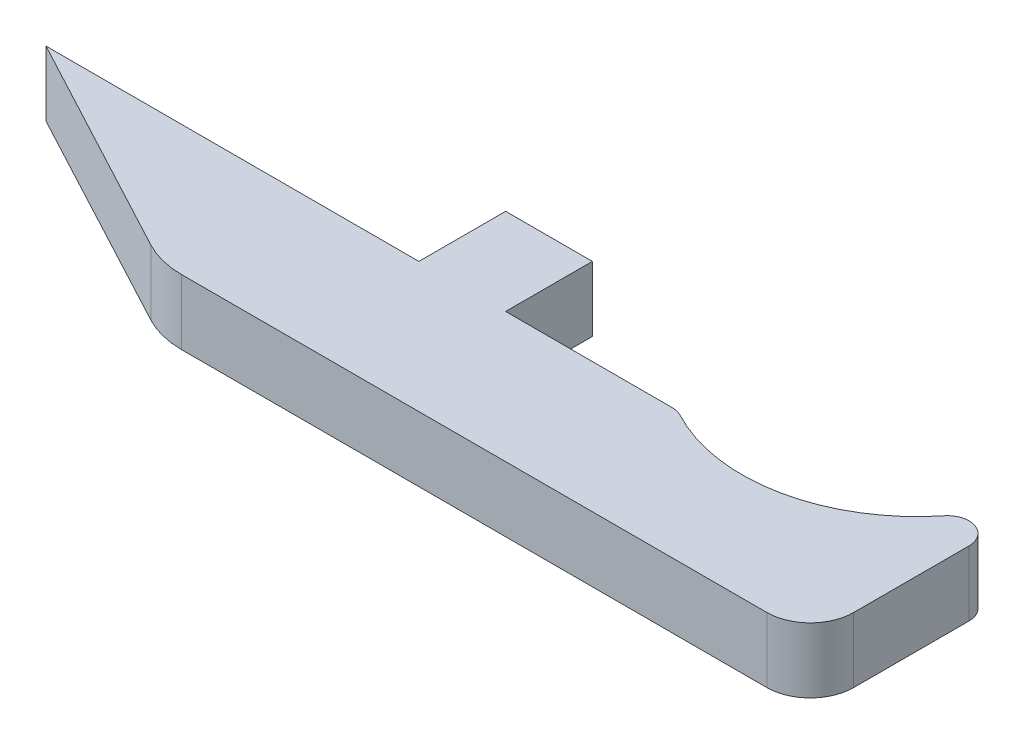
ISO-10303-21;
HEADER;
FILE_DESCRIPTION(('STEP AP214'),'2;1');
FILE_NAME('part.step','',(''),(''),'','','');
FILE_SCHEMA(('AUTOMOTIVE_DESIGN { 1 0 10303 214 1 1 1 1 }'));
ENDSEC;
DATA;
#1=APPLICATION_CONTEXT('core data for automotive mechanical design processes');
#2=APPLICATION_PROTOCOL_DEFINITION('international standard','automotive_design',2000,#1);
#3=PRODUCT_CONTEXT('',#1,'mechanical');
#4=PRODUCT('Part','Part','',(#3));
#5=PRODUCT_RELATED_PRODUCT_CATEGORY('part','',(#4));
#6=PRODUCT_DEFINITION_FORMATION('','',#4);
#7=PRODUCT_DEFINITION_CONTEXT('part definition',#1,'design');
#8=PRODUCT_DEFINITION('design','',#6,#7);
#9=PRODUCT_DEFINITION_SHAPE('','',#8);
#10=(LENGTH_UNIT() NAMED_UNIT(*) SI_UNIT(.MILLI.,.METRE.));
#11=(NAMED_UNIT(*) PLANE_ANGLE_UNIT() SI_UNIT($,.RADIAN.));
#12=(NAMED_UNIT(*) SI_UNIT($,.STERADIAN.) SOLID_ANGLE_UNIT());
#13=UNCERTAINTY_MEASURE_WITH_UNIT(LENGTH_MEASURE(1.E-05),#10,'distance_accuracy_value','');
#14=(GEOMETRIC_REPRESENTATION_CONTEXT(3) GLOBAL_UNCERTAINTY_ASSIGNED_CONTEXT((#13)) GLOBAL_UNIT_ASSIGNED_CONTEXT((#10,
#11,#12)) REPRESENTATION_CONTEXT('',''));
#15=CARTESIAN_POINT('',(0.,0.,0.));
#16=DIRECTION('',(0.,0.,1.));
#17=DIRECTION('',(1.,0.,0.));
#18=AXIS2_PLACEMENT_3D('',#15,#16,#17);
#19=CARTESIAN_POINT('',(0.,4.7625,42.5794309916899));
#20=DIRECTION('',(0.,0.,1.));
#21=DIRECTION('',(1.,0.,0.));
#22=AXIS2_PLACEMENT_3D('',#19,#20,#21);
#23=PLANE('',#22);
#24=DIRECTION('',(0.,-1.,0.));
#25=VECTOR('',#24,1.);
#26=CARTESIAN_POINT('',(39.9394999999781,4.7625,42.5794309916899));
#27=LINE('',#26,#25);
#28=CARTESIAN_POINT('',(39.9394999999781,4.7625,42.5794309916899));
#29=VERTEX_POINT('',#28);
#30=CARTESIAN_POINT('',(39.9394999999781,0.,42.5794309916899));
#31=VERTEX_POINT('',#30);
#32=EDGE_CURVE('E64',#29,#31,#27,.T.);
#33=ORIENTED_EDGE('',*,*,#32,.F.);
#34=DIRECTION('',(-1.,0.,0.));
#35=VECTOR('',#34,1.);
#36=CARTESIAN_POINT('',(0.,4.7625,42.5794309916899));
#37=LINE('',#36,#35);
#38=CARTESIAN_POINT('',(52.1487518651466,4.7625,42.5794309916899));
#39=VERTEX_POINT('',#38);
#40=EDGE_CURVE('E174',#39,#29,#37,.T.);
#41=ORIENTED_EDGE('',*,*,#40,.F.);
#42=DIRECTION('',(0.,1.,0.));
#43=VECTOR('',#42,1.);
#44=CARTESIAN_POINT('',(52.1487518651466,0.,42.5794309916899));
#45=LINE('',#44,#43);
#46=CARTESIAN_POINT('',(52.1487518651466,0.,42.5794309916899));
#47=VERTEX_POINT('',#46);
#48=EDGE_CURVE('E197',#39,#47,#45,.F.);
#49=ORIENTED_EDGE('',*,*,#48,.T.);
#50=DIRECTION('',(-1.,0.,0.));
#51=VECTOR('',#50,1.);
#52=CARTESIAN_POINT('',(0.,0.,42.5794309916899));
#53=LINE('',#52,#51);
#54=EDGE_CURVE('E186',#47,#31,#53,.T.);
#55=ORIENTED_EDGE('',*,*,#54,.T.);
#56=EDGE_LOOP('',(#33,#41,#49,#55));
#57=FACE_BOUND('',#56,.T.);
#58=ADVANCED_FACE('F41',(#57),#23,.F.);
#59=DIRECTION('',(0.,1.,0.));
#60=VECTOR('',#59,1.);
#61=CARTESIAN_POINT('',(33.5894999999781,4.7625,42.5794309916899));
#62=LINE('',#61,#60);
#63=CARTESIAN_POINT('',(33.5894999999781,0.,42.5794309916899));
#64=VERTEX_POINT('',#63);
#65=CARTESIAN_POINT('',(33.5894999999781,4.7625,42.5794309916899));
#66=VERTEX_POINT('',#65);
#67=EDGE_CURVE('E158',#64,#66,#62,.T.);
#68=ORIENTED_EDGE('',*,*,#67,.F.);
#69=CARTESIAN_POINT('',(6.28449999997809,0.,42.5794309916899));
#70=VERTEX_POINT('',#69);
#71=EDGE_CURVE('E164',#64,#70,#53,.T.);
#72=ORIENTED_EDGE('',*,*,#71,.T.);
#73=DIRECTION('',(0.,-1.,0.));
#74=VECTOR('',#73,1.);
#75=CARTESIAN_POINT('',(6.28449999997809,4.7625,42.5794309916899));
#76=LINE('',#75,#74);
#77=CARTESIAN_POINT('',(6.28449999997809,4.7625,42.5794309916899));
#78=VERTEX_POINT('',#77);
#79=EDGE_CURVE('E184',#78,#70,#76,.T.);
#80=ORIENTED_EDGE('',*,*,#79,.F.);
#81=EDGE_CURVE('E56',#66,#78,#37,.T.);
#82=ORIENTED_EDGE('',*,*,#81,.F.);
#83=EDGE_LOOP('',(#68,#72,#80,#82));
#84=FACE_BOUND('',#83,.T.);
#85=ADVANCED_FACE('F269',(#84),#23,.F.);
#86=CARTESIAN_POINT('',(58.9432399959774,4.7625,31.4542309916899));
#87=DIRECTION('',(0.,-1.,0.));
#88=DIRECTION('',(0.,0.,-1.));
#89=AXIS2_PLACEMENT_3D('',#86,#87,#88);
#90=CYLINDRICAL_SURFACE('',#89,12.827);
#91=CARTESIAN_POINT('',(58.9432399959774,0.,31.4542309916899));
#92=DIRECTION('',(0.,1.,0.));
#93=DIRECTION('',(0.,0.,1.));
#94=AXIS2_PLACEMENT_3D('',#91,#92,#93);
#95=CIRCLE('',#94,12.827);
#96=CARTESIAN_POINT('',(52.8970435095112,0.,42.7668538991789));
#97=VERTEX_POINT('',#96);
#98=CARTESIAN_POINT('',(68.9449095995016,0.,39.4853289329393));
#99=VERTEX_POINT('',#98);
#100=EDGE_CURVE('E161',#97,#99,#95,.T.);
#101=ORIENTED_EDGE('',*,*,#100,.F.);
#102=DIRECTION('',(0.,-1.,0.));
#103=VECTOR('',#102,1.);
#104=CARTESIAN_POINT('',(52.8970435095112,4.7625,42.7668538991789));
#105=LINE('',#104,#103);
#106=CARTESIAN_POINT('',(52.8970435095112,4.7625,42.7668538991789));
#107=VERTEX_POINT('',#106);
#108=EDGE_CURVE('E207',#97,#107,#105,.F.);
#109=ORIENTED_EDGE('',*,*,#108,.T.);
#110=CARTESIAN_POINT('',(58.9432399959774,4.7625,31.4542309916899));
#111=DIRECTION('',(0.,1.,0.));
#112=DIRECTION('',(0.,0.,1.));
#113=AXIS2_PLACEMENT_3D('',#110,#111,#112);
#114=CIRCLE('',#113,12.827);
#115=CARTESIAN_POINT('',(68.9449095995016,4.7625,39.4853289329393));
#116=VERTEX_POINT('',#115);
#117=EDGE_CURVE('E170',#107,#116,#114,.T.);
#118=ORIENTED_EDGE('',*,*,#117,.T.);
#119=DIRECTION('',(0.,-1.,0.));
#120=VECTOR('',#119,1.);
#121=CARTESIAN_POINT('',(68.9449095995016,4.7625,39.4853289329393));
#122=LINE('',#121,#120);
#123=EDGE_CURVE('E204',#116,#99,#122,.T.);
#124=ORIENTED_EDGE('',*,*,#123,.T.);
#125=EDGE_LOOP('',(#101,#109,#118,#124));
#126=FACE_BOUND('',#125,.T.);
#127=ADVANCED_FACE('F251',(#126),#90,.F.);
#128=CARTESIAN_POINT('',(-16.2877301957228,4.7625,30.5418282573009));
#129=DIRECTION('',(0.470560234606516,0.,-0.88236787430587));
#130=DIRECTION('',(-0.88236787430587,0.,-0.470560234606516));
#131=AXIS2_PLACEMENT_3D('',#128,#129,#130);
#132=PLANE('',#131);
#133=DIRECTION('',(0.88236787430587,0.,0.470560234606516));
#134=VECTOR('',#133,1.);
#135=CARTESIAN_POINT('',(-16.2877301957228,0.,30.5418282573009));
#136=LINE('',#135,#134);
#137=CARTESIAN_POINT('',(22.744575454511,0.,51.3574669935321));
#138=VERTEX_POINT('',#137);
#139=EDGE_CURVE('E188',#70,#138,#136,.T.);
#140=ORIENTED_EDGE('',*,*,#139,.T.);
#141=DIRECTION('',(0.,-1.,0.));
#142=VECTOR('',#141,1.);
#143=CARTESIAN_POINT('',(22.744575454511,4.7625,51.3574669935321));
#144=LINE('',#143,#142);
#145=CARTESIAN_POINT('',(22.744575454511,4.7625,51.3574669935321));
#146=VERTEX_POINT('',#145);
#147=EDGE_CURVE('E220',#138,#146,#144,.F.);
#148=ORIENTED_EDGE('',*,*,#147,.T.);
#149=DIRECTION('',(0.88236787430587,0.,0.470560234606516));
#150=VECTOR('',#149,1.);
#151=CARTESIAN_POINT('',(-16.2877301957228,4.7625,30.5418282573009));
#152=LINE('',#151,#150);
#153=EDGE_CURVE('E176',#78,#146,#152,.T.);
#154=ORIENTED_EDGE('',*,*,#153,.F.);
#155=ORIENTED_EDGE('',*,*,#79,.T.);
#156=EDGE_LOOP('',(#140,#148,#154,#155));
#157=FACE_BOUND('',#156,.T.);
#158=ADVANCED_FACE('F272',(#157),#132,.F.);
#159=CARTESIAN_POINT('',(0.,4.7625,52.1044309916899));
#160=DIRECTION('',(0.,0.,-1.));
#161=DIRECTION('',(-1.,0.,0.));
#162=AXIS2_PLACEMENT_3D('',#159,#160,#161);
#163=PLANE('',#162);
#164=DIRECTION('',(1.,0.,0.));
#165=VECTOR('',#164,1.);
#166=CARTESIAN_POINT('',(0.,0.,52.1044309916899));
#167=LINE('',#166,#165);
#168=CARTESIAN_POINT('',(25.7326329442624,0.,52.1044309916899));
#169=VERTEX_POINT('',#168);
#170=CARTESIAN_POINT('',(68.5952399959774,0.,52.1044309916899));
#171=VERTEX_POINT('',#170);
#172=EDGE_CURVE('E191',#169,#171,#167,.T.);
#173=ORIENTED_EDGE('',*,*,#172,.T.);
#174=DIRECTION('',(0.,-1.,0.));
#175=VECTOR('',#174,1.);
#176=CARTESIAN_POINT('',(68.5952399959774,4.7625,52.1044309916899));
#177=LINE('',#176,#175);
#178=CARTESIAN_POINT('',(68.5952399959774,4.7625,52.1044309916899));
#179=VERTEX_POINT('',#178);
#180=EDGE_CURVE('E49',#171,#179,#177,.F.);
#181=ORIENTED_EDGE('',*,*,#180,.T.);
#182=DIRECTION('',(1.,0.,0.));
#183=VECTOR('',#182,1.);
#184=CARTESIAN_POINT('',(0.,4.7625,52.1044309916899));
#185=LINE('',#184,#183);
#186=CARTESIAN_POINT('',(25.7326329442624,4.7625,52.1044309916899));
#187=VERTEX_POINT('',#186);
#188=EDGE_CURVE('E179',#187,#179,#185,.T.);
#189=ORIENTED_EDGE('',*,*,#188,.F.);
#190=DIRECTION('',(0.,-1.,0.));
#191=VECTOR('',#190,1.);
#192=CARTESIAN_POINT('',(25.7326329442624,4.7625,52.1044309916899));
#193=LINE('',#192,#191);
#194=EDGE_CURVE('E215',#187,#169,#193,.T.);
#195=ORIENTED_EDGE('',*,*,#194,.T.);
#196=EDGE_LOOP('',(#173,#181,#189,#195));
#197=FACE_BOUND('',#196,.T.);
#198=ADVANCED_FACE('F231',(#197),#163,.F.);
#199=CARTESIAN_POINT('',(71.7702399959774,4.7625,0.));
#200=DIRECTION('',(1.,0.,0.));
#201=DIRECTION('',(0.,0.,-1.));
#202=AXIS2_PLACEMENT_3D('',#199,#200,#201);
#203=PLANE('',#202);
#204=DIRECTION('',(0.,0.,1.));
#205=VECTOR('',#204,1.);
#206=CARTESIAN_POINT('',(71.7702399959774,4.7625,0.));
#207=LINE('',#206,#205);
#208=CARTESIAN_POINT('',(71.7702399959774,4.7625,40.4792766979454));
#209=VERTEX_POINT('',#208);
#210=CARTESIAN_POINT('',(71.7702399959774,4.7625,48.9294309916899));
#211=VERTEX_POINT('',#210);
#212=EDGE_CURVE('E182',#209,#211,#207,.T.);
#213=ORIENTED_EDGE('',*,*,#212,.T.);
#214=DIRECTION('',(0.,-1.,0.));
#215=VECTOR('',#214,1.);
#216=CARTESIAN_POINT('',(71.7702399959774,0.,48.9294309916899));
#217=LINE('',#216,#215);
#218=CARTESIAN_POINT('',(71.7702399959774,0.,48.9294309916899));
#219=VERTEX_POINT('',#218);
#220=EDGE_CURVE('E224',#211,#219,#217,.T.);
#221=ORIENTED_EDGE('',*,*,#220,.T.);
#222=DIRECTION('',(0.,0.,1.));
#223=VECTOR('',#222,1.);
#224=CARTESIAN_POINT('',(71.7702399959774,0.,0.));
#225=LINE('',#224,#223);
#226=CARTESIAN_POINT('',(71.7702399959774,0.,40.4792766979454));
#227=VERTEX_POINT('',#226);
#228=EDGE_CURVE('E173',#227,#219,#225,.T.);
#229=ORIENTED_EDGE('',*,*,#228,.F.);
#230=DIRECTION('',(0.,-1.,0.));
#231=VECTOR('',#230,1.);
#232=CARTESIAN_POINT('',(71.7702399959774,4.7625,40.4792766979454));
#233=LINE('',#232,#231);
#234=EDGE_CURVE('E213',#227,#209,#233,.F.);
#235=ORIENTED_EDGE('',*,*,#234,.T.);
#236=EDGE_LOOP('',(#213,#221,#229,#235));
#237=FACE_BOUND('',#236,.T.);
#238=ADVANCED_FACE('F243',(#237),#203,.T.);
#239=CARTESIAN_POINT('',(0.,4.7625,0.));
#240=DIRECTION('',(0.,1.,0.));
#241=DIRECTION('',(0.,0.,1.));
#242=AXIS2_PLACEMENT_3D('',#239,#240,#241);
#243=PLANE('',#242);
#244=ORIENTED_EDGE('',*,*,#188,.T.);
#245=CARTESIAN_POINT('',(68.5952399959774,4.7625,48.9294309916899));
#246=DIRECTION('',(0.,1.,0.));
#247=DIRECTION('',(0.,0.,1.));
#248=AXIS2_PLACEMENT_3D('',#245,#246,#247);
#249=CIRCLE('',#248,3.175);
#250=EDGE_CURVE('E11',#179,#211,#249,.T.);
#251=ORIENTED_EDGE('',*,*,#250,.T.);
#252=ORIENTED_EDGE('',*,*,#212,.F.);
#253=CARTESIAN_POINT('',(70.1827399959774,4.7625,40.4792766979454));
#254=DIRECTION('',(0.,1.,0.));
#255=DIRECTION('',(0.,0.,1.));
#256=AXIS2_PLACEMENT_3D('',#253,#254,#255);
#257=CIRCLE('',#256,1.5875);
#258=EDGE_CURVE('E209',#209,#116,#257,.T.);
#259=ORIENTED_EDGE('',*,*,#258,.T.);
#260=ORIENTED_EDGE('',*,*,#117,.F.);
#261=CARTESIAN_POINT('',(52.1487518651466,4.7625,44.1669309916899));
#262=DIRECTION('',(0.,1.,0.));
#263=DIRECTION('',(0.,0.,1.));
#264=AXIS2_PLACEMENT_3D('',#261,#262,#263);
#265=CIRCLE('',#264,1.5875);
#266=EDGE_CURVE('E211',#107,#39,#265,.T.);
#267=ORIENTED_EDGE('',*,*,#266,.T.);
#268=ORIENTED_EDGE('',*,*,#40,.T.);
#269=DIRECTION('',(0.,0.,1.));
#270=VECTOR('',#269,1.);
#271=CARTESIAN_POINT('',(39.9394999999781,4.7625,36.2294309916899));
#272=LINE('',#271,#270);
#273=CARTESIAN_POINT('',(39.9394999999781,4.7625,36.2294309916899));
#274=VERTEX_POINT('',#273);
#275=EDGE_CURVE('E258',#274,#29,#272,.T.);
#276=ORIENTED_EDGE('',*,*,#275,.F.);
#277=DIRECTION('',(1.,0.,0.));
#278=VECTOR('',#277,1.);
#279=CARTESIAN_POINT('',(39.9394999999781,4.7625,36.2294309916899));
#280=LINE('',#279,#278);
#281=CARTESIAN_POINT('',(33.5894999999781,4.7625,36.2294309916899));
#282=VERTEX_POINT('',#281);
#283=EDGE_CURVE('E154',#282,#274,#280,.T.);
#284=ORIENTED_EDGE('',*,*,#283,.F.);
#285=DIRECTION('',(0.,0.,1.));
#286=VECTOR('',#285,1.);
#287=CARTESIAN_POINT('',(33.5894999999781,4.7625,36.2294309916899));
#288=LINE('',#287,#286);
#289=EDGE_CURVE('E166',#282,#66,#288,.T.);
#290=ORIENTED_EDGE('',*,*,#289,.T.);
#291=ORIENTED_EDGE('',*,*,#81,.T.);
#292=ORIENTED_EDGE('',*,*,#153,.T.);
#293=CARTESIAN_POINT('',(25.7326329442624,4.7625,45.7544309916899));
#294=DIRECTION('',(0.,1.,0.));
#295=DIRECTION('',(0.,0.,1.));
#296=AXIS2_PLACEMENT_3D('',#293,#294,#295);
#297=CIRCLE('',#296,6.35);
#298=EDGE_CURVE('E222',#146,#187,#297,.T.);
#299=ORIENTED_EDGE('',*,*,#298,.T.);
#300=EDGE_LOOP('',(#244,#251,#252,#259,#260,#267,#268,#276,#284,#290,#291,#292,#299));
#301=FACE_BOUND('',#300,.T.);
#302=ADVANCED_FACE('F237',(#301),#243,.T.);
#303=CARTESIAN_POINT('',(0.,0.,0.));
#304=DIRECTION('',(0.,1.,0.));
#305=DIRECTION('',(0.,0.,1.));
#306=AXIS2_PLACEMENT_3D('',#303,#304,#305);
#307=PLANE('',#306);
#308=ORIENTED_EDGE('',*,*,#228,.T.);
#309=CARTESIAN_POINT('',(68.5952399959774,0.,48.9294309916899));
#310=DIRECTION('',(0.,1.,0.));
#311=DIRECTION('',(0.,0.,1.));
#312=AXIS2_PLACEMENT_3D('',#309,#310,#311);
#313=CIRCLE('',#312,3.175);
#314=EDGE_CURVE('E227',#219,#171,#313,.F.);
#315=ORIENTED_EDGE('',*,*,#314,.T.);
#316=ORIENTED_EDGE('',*,*,#172,.F.);
#317=CARTESIAN_POINT('',(25.7326329442624,0.,45.7544309916899));
#318=DIRECTION('',(0.,1.,0.));
#319=DIRECTION('',(0.,0.,1.));
#320=AXIS2_PLACEMENT_3D('',#317,#318,#319);
#321=CIRCLE('',#320,6.35);
#322=EDGE_CURVE('E218',#169,#138,#321,.F.);
#323=ORIENTED_EDGE('',*,*,#322,.T.);
#324=ORIENTED_EDGE('',*,*,#139,.F.);
#325=ORIENTED_EDGE('',*,*,#71,.F.);
#326=DIRECTION('',(0.,0.,1.));
#327=VECTOR('',#326,1.);
#328=CARTESIAN_POINT('',(33.5894999999781,0.,36.2294309916899));
#329=LINE('',#328,#327);
#330=CARTESIAN_POINT('',(33.5894999999781,0.,36.2294309916899));
#331=VERTEX_POINT('',#330);
#332=EDGE_CURVE('E145',#331,#64,#329,.T.);
#333=ORIENTED_EDGE('',*,*,#332,.F.);
#334=DIRECTION('',(-1.,0.,0.));
#335=VECTOR('',#334,1.);
#336=CARTESIAN_POINT('',(39.9394999999781,0.,36.2294309916899));
#337=LINE('',#336,#335);
#338=CARTESIAN_POINT('',(39.9394999999781,0.,36.2294309916899));
#339=VERTEX_POINT('',#338);
#340=EDGE_CURVE('E137',#339,#331,#337,.T.);
#341=ORIENTED_EDGE('',*,*,#340,.F.);
#342=DIRECTION('',(0.,0.,1.));
#343=VECTOR('',#342,1.);
#344=CARTESIAN_POINT('',(39.9394999999781,0.,36.2294309916899));
#345=LINE('',#344,#343);
#346=EDGE_CURVE('E143',#339,#31,#345,.T.);
#347=ORIENTED_EDGE('',*,*,#346,.T.);
#348=ORIENTED_EDGE('',*,*,#54,.F.);
#349=CARTESIAN_POINT('',(52.1487518651466,0.,44.1669309916899));
#350=DIRECTION('',(0.,1.,0.));
#351=DIRECTION('',(0.,0.,1.));
#352=AXIS2_PLACEMENT_3D('',#349,#350,#351);
#353=CIRCLE('',#352,1.5875);
#354=EDGE_CURVE('E202',#47,#97,#353,.F.);
#355=ORIENTED_EDGE('',*,*,#354,.T.);
#356=ORIENTED_EDGE('',*,*,#100,.T.);
#357=CARTESIAN_POINT('',(70.1827399959774,0.,40.4792766979454));
#358=DIRECTION('',(0.,1.,0.));
#359=DIRECTION('',(0.,0.,1.));
#360=AXIS2_PLACEMENT_3D('',#357,#358,#359);
#361=CIRCLE('',#360,1.5875);
#362=EDGE_CURVE('E200',#99,#227,#361,.F.);
#363=ORIENTED_EDGE('',*,*,#362,.T.);
#364=EDGE_LOOP('',(#308,#315,#316,#323,#324,#325,#333,#341,#347,#348,#355,#356,#363));
#365=FACE_BOUND('',#364,.T.);
#366=ADVANCED_FACE('F140',(#365),#307,.F.);
#367=CARTESIAN_POINT('',(52.1487518651466,4.7625,44.1669309916899));
#368=DIRECTION('',(0.,-1.,0.));
#369=DIRECTION('',(0.,0.,-1.));
#370=AXIS2_PLACEMENT_3D('',#367,#368,#369);
#371=CYLINDRICAL_SURFACE('',#370,1.5875);
#372=ORIENTED_EDGE('',*,*,#266,.F.);
#373=ORIENTED_EDGE('',*,*,#108,.F.);
#374=ORIENTED_EDGE('',*,*,#354,.F.);
#375=ORIENTED_EDGE('',*,*,#48,.F.);
#376=EDGE_LOOP('',(#372,#373,#374,#375));
#377=FACE_BOUND('',#376,.T.);
#378=ADVANCED_FACE('F257',(#377),#371,.T.);
#379=CARTESIAN_POINT('',(70.1827399959774,4.7625,40.4792766979454));
#380=DIRECTION('',(0.,-1.,0.));
#381=DIRECTION('',(0.,0.,-1.));
#382=AXIS2_PLACEMENT_3D('',#379,#380,#381);
#383=CYLINDRICAL_SURFACE('',#382,1.5875);
#384=ORIENTED_EDGE('',*,*,#258,.F.);
#385=ORIENTED_EDGE('',*,*,#234,.F.);
#386=ORIENTED_EDGE('',*,*,#362,.F.);
#387=ORIENTED_EDGE('',*,*,#123,.F.);
#388=EDGE_LOOP('',(#384,#385,#386,#387));
#389=FACE_BOUND('',#388,.T.);
#390=ADVANCED_FACE('F249',(#389),#383,.T.);
#391=CARTESIAN_POINT('',(25.7326329442624,4.7625,45.7544309916899));
#392=DIRECTION('',(0.,-1.,0.));
#393=DIRECTION('',(0.,0.,-1.));
#394=AXIS2_PLACEMENT_3D('',#391,#392,#393);
#395=CYLINDRICAL_SURFACE('',#394,6.35);
#396=ORIENTED_EDGE('',*,*,#298,.F.);
#397=ORIENTED_EDGE('',*,*,#147,.F.);
#398=ORIENTED_EDGE('',*,*,#322,.F.);
#399=ORIENTED_EDGE('',*,*,#194,.F.);
#400=EDGE_LOOP('',(#396,#397,#398,#399));
#401=FACE_BOUND('',#400,.T.);
#402=ADVANCED_FACE('F275',(#401),#395,.T.);
#403=CARTESIAN_POINT('',(68.5952399959774,4.7625,48.9294309916899));
#404=DIRECTION('',(0.,1.,0.));
#405=DIRECTION('',(0.,0.,1.));
#406=AXIS2_PLACEMENT_3D('',#403,#404,#405);
#407=CYLINDRICAL_SURFACE('',#406,3.175);
#408=ORIENTED_EDGE('',*,*,#250,.F.);
#409=ORIENTED_EDGE('',*,*,#180,.F.);
#410=ORIENTED_EDGE('',*,*,#314,.F.);
#411=ORIENTED_EDGE('',*,*,#220,.F.);
#412=EDGE_LOOP('',(#408,#409,#410,#411));
#413=FACE_BOUND('',#412,.T.);
#414=ADVANCED_FACE('F43',(#413),#407,.T.);
#415=CARTESIAN_POINT('',(39.9394999999781,4.7625,36.2294309916899));
#416=DIRECTION('',(-1.,0.,0.));
#417=DIRECTION('',(0.,0.,1.));
#418=AXIS2_PLACEMENT_3D('',#415,#416,#417);
#419=PLANE('',#418);
#420=ORIENTED_EDGE('',*,*,#32,.T.);
#421=ORIENTED_EDGE('',*,*,#346,.F.);
#422=DIRECTION('',(0.,-1.,0.));
#423=VECTOR('',#422,1.);
#424=CARTESIAN_POINT('',(39.9394999999781,4.7625,36.2294309916899));
#425=LINE('',#424,#423);
#426=EDGE_CURVE('E149',#274,#339,#425,.T.);
#427=ORIENTED_EDGE('',*,*,#426,.F.);
#428=ORIENTED_EDGE('',*,*,#275,.T.);
#429=EDGE_LOOP('',(#420,#421,#427,#428));
#430=FACE_BOUND('',#429,.T.);
#431=ADVANCED_FACE('F160',(#430),#419,.F.);
#432=CARTESIAN_POINT('',(33.5894999999781,4.7625,36.2294309916899));
#433=DIRECTION('',(1.,0.,0.));
#434=DIRECTION('',(0.,0.,-1.));
#435=AXIS2_PLACEMENT_3D('',#432,#433,#434);
#436=PLANE('',#435);
#437=ORIENTED_EDGE('',*,*,#67,.T.);
#438=ORIENTED_EDGE('',*,*,#289,.F.);
#439=DIRECTION('',(0.,1.,0.));
#440=VECTOR('',#439,1.);
#441=CARTESIAN_POINT('',(33.5894999999781,4.7625,36.2294309916899));
#442=LINE('',#441,#440);
#443=EDGE_CURVE('E148',#331,#282,#442,.T.);
#444=ORIENTED_EDGE('',*,*,#443,.F.);
#445=ORIENTED_EDGE('',*,*,#332,.T.);
#446=EDGE_LOOP('',(#437,#438,#444,#445));
#447=FACE_BOUND('',#446,.T.);
#448=ADVANCED_FACE('F267',(#447),#436,.F.);
#449=CARTESIAN_POINT('',(0.,0.,36.2294309916899));
#450=DIRECTION('',(0.,0.,-1.));
#451=DIRECTION('',(-1.,0.,0.));
#452=AXIS2_PLACEMENT_3D('',#449,#450,#451);
#453=PLANE('',#452);
#454=ORIENTED_EDGE('',*,*,#426,.T.);
#455=ORIENTED_EDGE('',*,*,#340,.T.);
#456=ORIENTED_EDGE('',*,*,#443,.T.);
#457=ORIENTED_EDGE('',*,*,#283,.T.);
#458=EDGE_LOOP('',(#454,#455,#456,#457));
#459=FACE_BOUND('',#458,.T.);
#460=ADVANCED_FACE('F152',(#459),#453,.T.);
#461=CLOSED_SHELL('',(#58,#85,#127,#158,#198,#238,#302,#366,#378,#390,#402,#414,#431,#448,#460));
#462=MANIFOLD_SOLID_BREP('B2',#461);
#463=ADVANCED_BREP_SHAPE_REPRESENTATION('',(#18,#462),#14);
#464=SHAPE_DEFINITION_REPRESENTATION(#9,#463);
ENDSEC;
END-ISO-10303-21;
